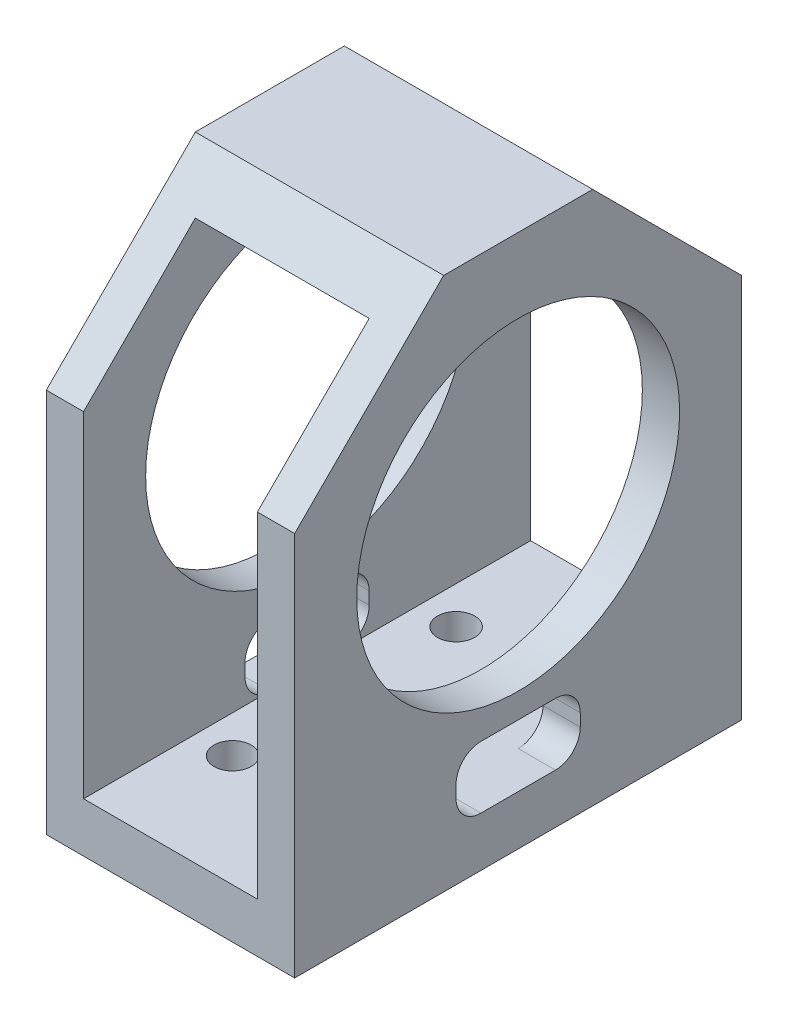
ISO-10303-21;
HEADER;
FILE_DESCRIPTION(('STEP AP214'),'2;1');
FILE_NAME('part.step','',(''),(''),'','','');
FILE_SCHEMA(('AUTOMOTIVE_DESIGN { 1 0 10303 214 1 1 1 1 }'));
ENDSEC;
DATA;
#1=APPLICATION_CONTEXT('core data for automotive mechanical design processes');
#2=APPLICATION_PROTOCOL_DEFINITION('international standard','automotive_design',2000,#1);
#3=PRODUCT_CONTEXT('',#1,'mechanical');
#4=PRODUCT('Part','Part','',(#3));
#5=PRODUCT_RELATED_PRODUCT_CATEGORY('part','',(#4));
#6=PRODUCT_DEFINITION_FORMATION('','',#4);
#7=PRODUCT_DEFINITION_CONTEXT('part definition',#1,'design');
#8=PRODUCT_DEFINITION('design','',#6,#7);
#9=PRODUCT_DEFINITION_SHAPE('','',#8);
#10=(LENGTH_UNIT() NAMED_UNIT(*) SI_UNIT(.MILLI.,.METRE.));
#11=(NAMED_UNIT(*) PLANE_ANGLE_UNIT() SI_UNIT($,.RADIAN.));
#12=(NAMED_UNIT(*) SI_UNIT($,.STERADIAN.) SOLID_ANGLE_UNIT());
#13=UNCERTAINTY_MEASURE_WITH_UNIT(LENGTH_MEASURE(1.E-05),#10,'distance_accuracy_value','');
#14=(GEOMETRIC_REPRESENTATION_CONTEXT(3) GLOBAL_UNCERTAINTY_ASSIGNED_CONTEXT((#13)) GLOBAL_UNIT_ASSIGNED_CONTEXT((#10,
#11,#12)) REPRESENTATION_CONTEXT('',''));
#15=CARTESIAN_POINT('',(0.,0.,0.));
#16=DIRECTION('',(0.,0.,1.));
#17=DIRECTION('',(1.,0.,0.));
#18=AXIS2_PLACEMENT_3D('',#15,#16,#17);
#19=CARTESIAN_POINT('',(0.,4.,0.));
#20=DIRECTION('',(0.,-1.,0.));
#21=DIRECTION('',(0.,0.,-1.));
#22=AXIS2_PLACEMENT_3D('',#19,#20,#21);
#23=PLANE('',#22);
#24=CARTESIAN_POINT('',(-4.,4.,-9.));
#25=DIRECTION('',(0.,1.,0.));
#26=DIRECTION('',(0.,0.,-1.));
#27=AXIS2_PLACEMENT_3D('',#24,#25,#26);
#28=CIRCLE('',#27,1.5);
#29=CARTESIAN_POINT('',(-4.,4.,-10.5));
#30=VERTEX_POINT('',#29);
#31=EDGE_CURVE('E399',#30,#30,#28,.T.);
#32=ORIENTED_EDGE('',*,*,#31,.F.);
#33=EDGE_LOOP('',(#32));
#34=FACE_BOUND('',#33,.T.);
#35=CARTESIAN_POINT('',(4.,4.,-9.));
#36=DIRECTION('',(0.,1.,0.));
#37=DIRECTION('',(0.,0.,1.));
#38=AXIS2_PLACEMENT_3D('',#35,#36,#37);
#39=CIRCLE('',#38,1.5);
#40=CARTESIAN_POINT('',(4.,4.,-7.5));
#41=VERTEX_POINT('',#40);
#42=EDGE_CURVE('E398',#41,#41,#39,.T.);
#43=ORIENTED_EDGE('',*,*,#42,.F.);
#44=EDGE_LOOP('',(#43));
#45=FACE_BOUND('',#44,.T.);
#46=DIRECTION('',(0.,0.,-1.));
#47=VECTOR('',#46,1.);
#48=CARTESIAN_POINT('',(-10.,4.,5.));
#49=LINE('',#48,#47);
#50=CARTESIAN_POINT('',(-10.,4.,3.));
#51=VERTEX_POINT('',#50);
#52=CARTESIAN_POINT('',(-10.,4.,-3.));
#53=VERTEX_POINT('',#52);
#54=EDGE_CURVE('E372',#51,#53,#49,.T.);
#55=ORIENTED_EDGE('',*,*,#54,.F.);
#56=DIRECTION('',(1.,0.,0.));
#57=VECTOR('',#56,1.);
#58=CARTESIAN_POINT('',(-7.,4.,3.));
#59=LINE('',#58,#57);
#60=CARTESIAN_POINT('',(-7.,4.,3.));
#61=VERTEX_POINT('',#60);
#62=EDGE_CURVE('E281',#51,#61,#59,.T.);
#63=ORIENTED_EDGE('',*,*,#62,.T.);
#64=DIRECTION('',(0.,0.,-1.));
#65=VECTOR('',#64,1.);
#66=CARTESIAN_POINT('',(-7.,4.,-18.));
#67=LINE('',#66,#65);
#68=CARTESIAN_POINT('',(-7.,4.,18.));
#69=VERTEX_POINT('',#68);
#70=EDGE_CURVE('E468',#69,#61,#67,.T.);
#71=ORIENTED_EDGE('',*,*,#70,.F.);
#72=DIRECTION('',(1.,0.,0.));
#73=VECTOR('',#72,1.);
#74=CARTESIAN_POINT('',(-10.,4.,18.));
#75=LINE('',#74,#73);
#76=CARTESIAN_POINT('',(7.,4.,18.));
#77=VERTEX_POINT('',#76);
#78=EDGE_CURVE('E256',#69,#77,#75,.T.);
#79=ORIENTED_EDGE('',*,*,#78,.T.);
#80=DIRECTION('',(0.,0.,1.));
#81=VECTOR('',#80,1.);
#82=CARTESIAN_POINT('',(7.,4.,-18.));
#83=LINE('',#82,#81);
#84=CARTESIAN_POINT('',(7.00000000000001,4.,3.));
#85=VERTEX_POINT('',#84);
#86=EDGE_CURVE('E356',#85,#77,#83,.T.);
#87=ORIENTED_EDGE('',*,*,#86,.F.);
#88=DIRECTION('',(1.,0.,0.));
#89=VECTOR('',#88,1.);
#90=CARTESIAN_POINT('',(10.,4.,3.));
#91=LINE('',#90,#89);
#92=CARTESIAN_POINT('',(10.,4.,3.));
#93=VERTEX_POINT('',#92);
#94=EDGE_CURVE('E273',#85,#93,#91,.T.);
#95=ORIENTED_EDGE('',*,*,#94,.T.);
#96=DIRECTION('',(0.,0.,-1.));
#97=VECTOR('',#96,1.);
#98=CARTESIAN_POINT('',(10.,4.,5.));
#99=LINE('',#98,#97);
#100=CARTESIAN_POINT('',(10.,4.,-3.));
#101=VERTEX_POINT('',#100);
#102=EDGE_CURVE('E347',#93,#101,#99,.T.);
#103=ORIENTED_EDGE('',*,*,#102,.T.);
#104=DIRECTION('',(1.,0.,0.));
#105=VECTOR('',#104,1.);
#106=CARTESIAN_POINT('',(7.,4.,-3.));
#107=LINE('',#106,#105);
#108=CARTESIAN_POINT('',(7.00000000000001,4.,-3.));
#109=VERTEX_POINT('',#108);
#110=EDGE_CURVE('E276',#101,#109,#107,.F.);
#111=ORIENTED_EDGE('',*,*,#110,.T.);
#112=CARTESIAN_POINT('',(7.,4.,-18.));
#113=VERTEX_POINT('',#112);
#114=EDGE_CURVE('E458',#113,#109,#83,.T.);
#115=ORIENTED_EDGE('',*,*,#114,.F.);
#116=DIRECTION('',(-1.,0.,0.));
#117=VECTOR('',#116,1.);
#118=CARTESIAN_POINT('',(-10.,4.,-18.));
#119=LINE('',#118,#117);
#120=CARTESIAN_POINT('',(-7.,4.,-18.));
#121=VERTEX_POINT('',#120);
#122=EDGE_CURVE('E474',#113,#121,#119,.T.);
#123=ORIENTED_EDGE('',*,*,#122,.T.);
#124=CARTESIAN_POINT('',(-7.,4.,-3.));
#125=VERTEX_POINT('',#124);
#126=EDGE_CURVE('E463',#125,#121,#67,.T.);
#127=ORIENTED_EDGE('',*,*,#126,.F.);
#128=DIRECTION('',(1.,0.,0.));
#129=VECTOR('',#128,1.);
#130=CARTESIAN_POINT('',(-10.,4.,-3.));
#131=LINE('',#130,#129);
#132=EDGE_CURVE('E279',#125,#53,#131,.F.);
#133=ORIENTED_EDGE('',*,*,#132,.T.);
#134=EDGE_LOOP('',(#55,#63,#71,#79,#87,#95,#103,#111,#115,#123,#127,#133));
#135=FACE_BOUND('',#134,.T.);
#136=CARTESIAN_POINT('',(-4.,4.,9.));
#137=DIRECTION('',(0.,1.,0.));
#138=DIRECTION('',(0.,0.,1.));
#139=AXIS2_PLACEMENT_3D('',#136,#137,#138);
#140=CIRCLE('',#139,1.5);
#141=CARTESIAN_POINT('',(-4.,4.,10.5));
#142=VERTEX_POINT('',#141);
#143=EDGE_CURVE('E388',#142,#142,#140,.T.);
#144=ORIENTED_EDGE('',*,*,#143,.F.);
#145=EDGE_LOOP('',(#144));
#146=FACE_BOUND('',#145,.T.);
#147=CARTESIAN_POINT('',(4.,4.,9.));
#148=DIRECTION('',(0.,1.,0.));
#149=DIRECTION('',(0.,0.,-1.));
#150=AXIS2_PLACEMENT_3D('',#147,#148,#149);
#151=CIRCLE('',#150,1.5);
#152=CARTESIAN_POINT('',(4.,4.,7.5));
#153=VERTEX_POINT('',#152);
#154=EDGE_CURVE('E392',#153,#153,#151,.T.);
#155=ORIENTED_EDGE('',*,*,#154,.F.);
#156=EDGE_LOOP('',(#155));
#157=FACE_BOUND('',#156,.T.);
#158=ADVANCED_FACE('F37',(#34,#45,#135,#146,#157),#23,.F.);
#159=CARTESIAN_POINT('',(10.,4.,18.));
#160=DIRECTION('',(-1.,0.,0.));
#161=DIRECTION('',(0.,0.,1.));
#162=AXIS2_PLACEMENT_3D('',#159,#160,#161);
#163=PLANE('',#162);
#164=ORIENTED_EDGE('',*,*,#102,.F.);
#165=CARTESIAN_POINT('',(10.,6.,3.));
#166=DIRECTION('',(-1.,0.,0.));
#167=DIRECTION('',(0.,0.,1.));
#168=AXIS2_PLACEMENT_3D('',#165,#166,#167);
#169=CIRCLE('',#168,2.);
#170=CARTESIAN_POINT('',(10.,6.,5.));
#171=VERTEX_POINT('',#170);
#172=EDGE_CURVE('E45',#93,#171,#169,.T.);
#173=ORIENTED_EDGE('',*,*,#172,.T.);
#174=DIRECTION('',(0.,-1.,0.));
#175=VECTOR('',#174,1.);
#176=CARTESIAN_POINT('',(10.,4.,5.));
#177=LINE('',#176,#175);
#178=CARTESIAN_POINT('',(10.,7.,5.));
#179=VERTEX_POINT('',#178);
#180=EDGE_CURVE('E345',#179,#171,#177,.T.);
#181=ORIENTED_EDGE('',*,*,#180,.F.);
#182=CARTESIAN_POINT('',(10.,7.,3.));
#183=DIRECTION('',(-1.,0.,0.));
#184=DIRECTION('',(0.,0.,1.));
#185=AXIS2_PLACEMENT_3D('',#182,#183,#184);
#186=CIRCLE('',#185,2.);
#187=CARTESIAN_POINT('',(10.,9.,3.));
#188=VERTEX_POINT('',#187);
#189=EDGE_CURVE('E338',#179,#188,#186,.T.);
#190=ORIENTED_EDGE('',*,*,#189,.T.);
#191=DIRECTION('',(0.,0.,1.));
#192=VECTOR('',#191,1.);
#193=CARTESIAN_POINT('',(10.,9.,5.));
#194=LINE('',#193,#192);
#195=CARTESIAN_POINT('',(10.,9.,-3.));
#196=VERTEX_POINT('',#195);
#197=EDGE_CURVE('E363',#196,#188,#194,.T.);
#198=ORIENTED_EDGE('',*,*,#197,.F.);
#199=CARTESIAN_POINT('',(10.,7.,-3.));
#200=DIRECTION('',(-1.,0.,0.));
#201=DIRECTION('',(0.,0.,1.));
#202=AXIS2_PLACEMENT_3D('',#199,#200,#201);
#203=CIRCLE('',#202,2.);
#204=CARTESIAN_POINT('',(10.,7.,-5.));
#205=VERTEX_POINT('',#204);
#206=EDGE_CURVE('E334',#196,#205,#203,.T.);
#207=ORIENTED_EDGE('',*,*,#206,.T.);
#208=DIRECTION('',(0.,1.,0.));
#209=VECTOR('',#208,1.);
#210=CARTESIAN_POINT('',(10.,4.,-5.));
#211=LINE('',#210,#209);
#212=CARTESIAN_POINT('',(10.,6.,-5.));
#213=VERTEX_POINT('',#212);
#214=EDGE_CURVE('E369',#213,#205,#211,.T.);
#215=ORIENTED_EDGE('',*,*,#214,.F.);
#216=CARTESIAN_POINT('',(10.,6.,-3.));
#217=DIRECTION('',(-1.,0.,0.));
#218=DIRECTION('',(0.,0.,1.));
#219=AXIS2_PLACEMENT_3D('',#216,#217,#218);
#220=CIRCLE('',#219,2.);
#221=EDGE_CURVE('E330',#213,#101,#220,.T.);
#222=ORIENTED_EDGE('',*,*,#221,.T.);
#223=EDGE_LOOP('',(#164,#173,#181,#190,#198,#207,#215,#222));
#224=FACE_BOUND('',#223,.T.);
#225=CARTESIAN_POINT('',(10.,24.,0.));
#226=DIRECTION('',(1.,0.,0.));
#227=DIRECTION('',(0.,0.,-1.));
#228=AXIS2_PLACEMENT_3D('',#225,#226,#227);
#229=CIRCLE('',#228,13.);
#230=CARTESIAN_POINT('',(10.,24.,-13.));
#231=VERTEX_POINT('',#230);
#232=EDGE_CURVE('E442',#231,#231,#229,.T.);
#233=ORIENTED_EDGE('',*,*,#232,.F.);
#234=EDGE_LOOP('',(#233));
#235=FACE_BOUND('',#234,.T.);
#236=DIRECTION('',(0.,0.,-1.));
#237=VECTOR('',#236,1.);
#238=CARTESIAN_POINT('',(10.,43.,-18.));
#239=LINE('',#238,#237);
#240=CARTESIAN_POINT('',(10.,43.,6.));
#241=VERTEX_POINT('',#240);
#242=CARTESIAN_POINT('',(10.,43.,-6.));
#243=VERTEX_POINT('',#242);
#244=EDGE_CURVE('E451',#241,#243,#239,.T.);
#245=ORIENTED_EDGE('',*,*,#244,.F.);
#246=DIRECTION('',(0.,0.707106781186548,-0.707106781186548));
#247=VECTOR('',#246,1.);
#248=CARTESIAN_POINT('',(10.,43.,6.));
#249=LINE('',#248,#247);
#250=CARTESIAN_POINT('',(10.,31.,18.));
#251=VERTEX_POINT('',#250);
#252=EDGE_CURVE('E235',#251,#241,#249,.T.);
#253=ORIENTED_EDGE('',*,*,#252,.F.);
#254=DIRECTION('',(0.,-1.,0.));
#255=VECTOR('',#254,1.);
#256=CARTESIAN_POINT('',(10.,4.,18.));
#257=LINE('',#256,#255);
#258=CARTESIAN_POINT('',(10.,0.,18.));
#259=VERTEX_POINT('',#258);
#260=EDGE_CURVE('E252',#251,#259,#257,.T.);
#261=ORIENTED_EDGE('',*,*,#260,.T.);
#262=DIRECTION('',(0.,0.,-1.));
#263=VECTOR('',#262,1.);
#264=CARTESIAN_POINT('',(10.,0.,18.));
#265=LINE('',#264,#263);
#266=CARTESIAN_POINT('',(10.,0.,-18.));
#267=VERTEX_POINT('',#266);
#268=EDGE_CURVE('E473',#259,#267,#265,.T.);
#269=ORIENTED_EDGE('',*,*,#268,.T.);
#270=DIRECTION('',(0.,-1.,0.));
#271=VECTOR('',#270,1.);
#272=CARTESIAN_POINT('',(10.,4.,-18.));
#273=LINE('',#272,#271);
#274=CARTESIAN_POINT('',(10.,31.,-18.));
#275=VERTEX_POINT('',#274);
#276=EDGE_CURVE('E254',#275,#267,#273,.T.);
#277=ORIENTED_EDGE('',*,*,#276,.F.);
#278=DIRECTION('',(0.,-0.707106781186547,-0.707106781186548));
#279=VECTOR('',#278,1.);
#280=CARTESIAN_POINT('',(10.,43.,-6.));
#281=LINE('',#280,#279);
#282=EDGE_CURVE('E410',#243,#275,#281,.T.);
#283=ORIENTED_EDGE('',*,*,#282,.F.);
#284=EDGE_LOOP('',(#245,#253,#261,#269,#277,#283));
#285=FACE_BOUND('',#284,.T.);
#286=ADVANCED_FACE('F343',(#224,#235,#285),#163,.F.);
#287=CARTESIAN_POINT('',(-10.,4.,-18.));
#288=DIRECTION('',(0.,0.,1.));
#289=DIRECTION('',(1.,0.,0.));
#290=AXIS2_PLACEMENT_3D('',#287,#288,#289);
#291=PLANE('',#290);
#292=DIRECTION('',(0.,-1.,0.));
#293=VECTOR('',#292,1.);
#294=CARTESIAN_POINT('',(-10.,4.,-18.));
#295=LINE('',#294,#293);
#296=CARTESIAN_POINT('',(-10.,31.,-18.));
#297=VERTEX_POINT('',#296);
#298=CARTESIAN_POINT('',(-10.,0.,-18.));
#299=VERTEX_POINT('',#298);
#300=EDGE_CURVE('E251',#297,#299,#295,.T.);
#301=ORIENTED_EDGE('',*,*,#300,.F.);
#302=DIRECTION('',(1.,0.,0.));
#303=VECTOR('',#302,1.);
#304=CARTESIAN_POINT('',(-10.,31.,-18.));
#305=LINE('',#304,#303);
#306=CARTESIAN_POINT('',(-7.,31.,-18.));
#307=VERTEX_POINT('',#306);
#308=EDGE_CURVE('E423',#297,#307,#305,.T.);
#309=ORIENTED_EDGE('',*,*,#308,.T.);
#310=DIRECTION('',(0.,-1.,0.));
#311=VECTOR('',#310,1.);
#312=CARTESIAN_POINT('',(-7.,40.,-18.));
#313=LINE('',#312,#311);
#314=EDGE_CURVE('E467',#307,#121,#313,.T.);
#315=ORIENTED_EDGE('',*,*,#314,.T.);
#316=ORIENTED_EDGE('',*,*,#122,.F.);
#317=DIRECTION('',(0.,-1.,0.));
#318=VECTOR('',#317,1.);
#319=CARTESIAN_POINT('',(7.,40.,-18.));
#320=LINE('',#319,#318);
#321=CARTESIAN_POINT('',(7.,31.,-18.));
#322=VERTEX_POINT('',#321);
#323=EDGE_CURVE('E461',#322,#113,#320,.T.);
#324=ORIENTED_EDGE('',*,*,#323,.F.);
#325=EDGE_CURVE('E420',#322,#275,#305,.T.);
#326=ORIENTED_EDGE('',*,*,#325,.T.);
#327=ORIENTED_EDGE('',*,*,#276,.T.);
#328=DIRECTION('',(-1.,0.,0.));
#329=VECTOR('',#328,1.);
#330=CARTESIAN_POINT('',(-10.,0.,-18.));
#331=LINE('',#330,#329);
#332=EDGE_CURVE('E482',#267,#299,#331,.T.);
#333=ORIENTED_EDGE('',*,*,#332,.T.);
#334=EDGE_LOOP('',(#301,#309,#315,#316,#324,#326,#327,#333));
#335=FACE_BOUND('',#334,.T.);
#336=ADVANCED_FACE('F501',(#335),#291,.F.);
#337=CARTESIAN_POINT('',(-10.,4.,18.));
#338=DIRECTION('',(1.,0.,0.));
#339=DIRECTION('',(0.,0.,-1.));
#340=AXIS2_PLACEMENT_3D('',#337,#338,#339);
#341=PLANE('',#340);
#342=DIRECTION('',(0.,1.,0.));
#343=VECTOR('',#342,1.);
#344=CARTESIAN_POINT('',(-10.,4.,-5.));
#345=LINE('',#344,#343);
#346=CARTESIAN_POINT('',(-10.,6.,-5.));
#347=VERTEX_POINT('',#346);
#348=CARTESIAN_POINT('',(-10.,7.,-5.));
#349=VERTEX_POINT('',#348);
#350=EDGE_CURVE('E531',#347,#349,#345,.T.);
#351=ORIENTED_EDGE('',*,*,#350,.T.);
#352=CARTESIAN_POINT('',(-10.,7.,-3.));
#353=DIRECTION('',(1.,0.,0.));
#354=DIRECTION('',(0.,0.,-1.));
#355=AXIS2_PLACEMENT_3D('',#352,#353,#354);
#356=CIRCLE('',#355,2.);
#357=CARTESIAN_POINT('',(-10.,9.,-3.));
#358=VERTEX_POINT('',#357);
#359=EDGE_CURVE('E323',#349,#358,#356,.T.);
#360=ORIENTED_EDGE('',*,*,#359,.T.);
#361=DIRECTION('',(0.,0.,1.));
#362=VECTOR('',#361,1.);
#363=CARTESIAN_POINT('',(-10.,9.,5.));
#364=LINE('',#363,#362);
#365=CARTESIAN_POINT('',(-10.,9.,3.));
#366=VERTEX_POINT('',#365);
#367=EDGE_CURVE('E382',#358,#366,#364,.T.);
#368=ORIENTED_EDGE('',*,*,#367,.T.);
#369=CARTESIAN_POINT('',(-10.,7.,3.));
#370=DIRECTION('',(1.,0.,0.));
#371=DIRECTION('',(0.,0.,-1.));
#372=AXIS2_PLACEMENT_3D('',#369,#370,#371);
#373=CIRCLE('',#372,2.);
#374=CARTESIAN_POINT('',(-10.,7.,5.));
#375=VERTEX_POINT('',#374);
#376=EDGE_CURVE('E319',#366,#375,#373,.T.);
#377=ORIENTED_EDGE('',*,*,#376,.T.);
#378=DIRECTION('',(0.,-1.,0.));
#379=VECTOR('',#378,1.);
#380=CARTESIAN_POINT('',(-10.,4.,5.));
#381=LINE('',#380,#379);
#382=CARTESIAN_POINT('',(-10.,6.,5.));
#383=VERTEX_POINT('',#382);
#384=EDGE_CURVE('E368',#375,#383,#381,.T.);
#385=ORIENTED_EDGE('',*,*,#384,.T.);
#386=CARTESIAN_POINT('',(-10.,6.,3.));
#387=DIRECTION('',(1.,0.,0.));
#388=DIRECTION('',(0.,0.,-1.));
#389=AXIS2_PLACEMENT_3D('',#386,#387,#388);
#390=CIRCLE('',#389,2.);
#391=EDGE_CURVE('E315',#383,#51,#390,.T.);
#392=ORIENTED_EDGE('',*,*,#391,.T.);
#393=ORIENTED_EDGE('',*,*,#54,.T.);
#394=CARTESIAN_POINT('',(-10.,6.,-3.));
#395=DIRECTION('',(1.,0.,0.));
#396=DIRECTION('',(0.,0.,-1.));
#397=AXIS2_PLACEMENT_3D('',#394,#395,#396);
#398=CIRCLE('',#397,2.);
#399=EDGE_CURVE('E328',#53,#347,#398,.T.);
#400=ORIENTED_EDGE('',*,*,#399,.T.);
#401=EDGE_LOOP('',(#351,#360,#368,#377,#385,#392,#393,#400));
#402=FACE_BOUND('',#401,.T.);
#403=CARTESIAN_POINT('',(-10.,24.,0.));
#404=DIRECTION('',(1.,0.,0.));
#405=DIRECTION('',(0.,0.,-1.));
#406=AXIS2_PLACEMENT_3D('',#403,#404,#405);
#407=CIRCLE('',#406,13.);
#408=CARTESIAN_POINT('',(-10.,24.,-13.));
#409=VERTEX_POINT('',#408);
#410=EDGE_CURVE('E266',#409,#409,#407,.T.);
#411=ORIENTED_EDGE('',*,*,#410,.T.);
#412=EDGE_LOOP('',(#411));
#413=FACE_BOUND('',#412,.T.);
#414=DIRECTION('',(0.,-1.,0.));
#415=VECTOR('',#414,1.);
#416=CARTESIAN_POINT('',(-10.,4.,18.));
#417=LINE('',#416,#415);
#418=CARTESIAN_POINT('',(-10.,31.,18.));
#419=VERTEX_POINT('',#418);
#420=CARTESIAN_POINT('',(-10.,0.,18.));
#421=VERTEX_POINT('',#420);
#422=EDGE_CURVE('E242',#419,#421,#417,.T.);
#423=ORIENTED_EDGE('',*,*,#422,.F.);
#424=DIRECTION('',(0.,0.707106781186548,-0.707106781186548));
#425=VECTOR('',#424,1.);
#426=CARTESIAN_POINT('',(-10.,43.,6.));
#427=LINE('',#426,#425);
#428=CARTESIAN_POINT('',(-10.,43.,6.));
#429=VERTEX_POINT('',#428);
#430=EDGE_CURVE('E223',#419,#429,#427,.T.);
#431=ORIENTED_EDGE('',*,*,#430,.T.);
#432=DIRECTION('',(0.,0.,1.));
#433=VECTOR('',#432,1.);
#434=CARTESIAN_POINT('',(-10.,43.,-18.));
#435=LINE('',#434,#433);
#436=CARTESIAN_POINT('',(-10.,43.,-6.));
#437=VERTEX_POINT('',#436);
#438=EDGE_CURVE('E449',#437,#429,#435,.T.);
#439=ORIENTED_EDGE('',*,*,#438,.F.);
#440=DIRECTION('',(0.,-0.707106781186547,-0.707106781186548));
#441=VECTOR('',#440,1.);
#442=CARTESIAN_POINT('',(-10.,43.,-6.));
#443=LINE('',#442,#441);
#444=EDGE_CURVE('E417',#437,#297,#443,.T.);
#445=ORIENTED_EDGE('',*,*,#444,.T.);
#446=ORIENTED_EDGE('',*,*,#300,.T.);
#447=DIRECTION('',(0.,0.,1.));
#448=VECTOR('',#447,1.);
#449=CARTESIAN_POINT('',(-10.,0.,18.));
#450=LINE('',#449,#448);
#451=EDGE_CURVE('E249',#299,#421,#450,.T.);
#452=ORIENTED_EDGE('',*,*,#451,.T.);
#453=EDGE_LOOP('',(#423,#431,#439,#445,#446,#452));
#454=FACE_BOUND('',#453,.T.);
#455=ADVANCED_FACE('F247',(#402,#413,#454),#341,.F.);
#456=CARTESIAN_POINT('',(-10.,4.,18.));
#457=DIRECTION('',(0.,0.,-1.));
#458=DIRECTION('',(-1.,0.,0.));
#459=AXIS2_PLACEMENT_3D('',#456,#457,#458);
#460=PLANE('',#459);
#461=ORIENTED_EDGE('',*,*,#260,.F.);
#462=DIRECTION('',(1.,0.,0.));
#463=VECTOR('',#462,1.);
#464=CARTESIAN_POINT('',(-10.,31.,18.));
#465=LINE('',#464,#463);
#466=CARTESIAN_POINT('',(7.00000000000001,31.,18.));
#467=VERTEX_POINT('',#466);
#468=EDGE_CURVE('E234',#467,#251,#465,.T.);
#469=ORIENTED_EDGE('',*,*,#468,.F.);
#470=DIRECTION('',(0.,-1.,0.));
#471=VECTOR('',#470,1.);
#472=CARTESIAN_POINT('',(7.00000000000001,40.,18.));
#473=LINE('',#472,#471);
#474=EDGE_CURVE('E457',#467,#77,#473,.T.);
#475=ORIENTED_EDGE('',*,*,#474,.T.);
#476=ORIENTED_EDGE('',*,*,#78,.F.);
#477=DIRECTION('',(0.,-1.,0.));
#478=VECTOR('',#477,1.);
#479=CARTESIAN_POINT('',(-7.,40.,18.));
#480=LINE('',#479,#478);
#481=CARTESIAN_POINT('',(-7.,31.,18.));
#482=VERTEX_POINT('',#481);
#483=EDGE_CURVE('E245',#482,#69,#480,.T.);
#484=ORIENTED_EDGE('',*,*,#483,.F.);
#485=EDGE_CURVE('E226',#419,#482,#465,.T.);
#486=ORIENTED_EDGE('',*,*,#485,.F.);
#487=ORIENTED_EDGE('',*,*,#422,.T.);
#488=DIRECTION('',(1.,0.,0.));
#489=VECTOR('',#488,1.);
#490=CARTESIAN_POINT('',(-10.,0.,18.));
#491=LINE('',#490,#489);
#492=EDGE_CURVE('E477',#421,#259,#491,.T.);
#493=ORIENTED_EDGE('',*,*,#492,.T.);
#494=EDGE_LOOP('',(#461,#469,#475,#476,#484,#486,#487,#493));
#495=FACE_BOUND('',#494,.T.);
#496=ADVANCED_FACE('F240',(#495),#460,.F.);
#497=CARTESIAN_POINT('',(0.,0.,0.));
#498=DIRECTION('',(0.,-1.,0.));
#499=DIRECTION('',(0.,0.,-1.));
#500=AXIS2_PLACEMENT_3D('',#497,#498,#499);
#501=PLANE('',#500);
#502=CARTESIAN_POINT('',(-4.,0.,-9.));
#503=DIRECTION('',(0.,1.,0.));
#504=DIRECTION('',(0.,0.,-1.));
#505=AXIS2_PLACEMENT_3D('',#502,#503,#504);
#506=CIRCLE('',#505,1.5);
#507=CARTESIAN_POINT('',(-4.,0.,-10.5));
#508=VERTEX_POINT('',#507);
#509=EDGE_CURVE('E395',#508,#508,#506,.T.);
#510=ORIENTED_EDGE('',*,*,#509,.T.);
#511=EDGE_LOOP('',(#510));
#512=FACE_BOUND('',#511,.T.);
#513=CARTESIAN_POINT('',(4.,0.,9.));
#514=DIRECTION('',(0.,1.,0.));
#515=DIRECTION('',(0.,0.,-1.));
#516=AXIS2_PLACEMENT_3D('',#513,#514,#515);
#517=CIRCLE('',#516,1.5);
#518=CARTESIAN_POINT('',(4.,0.,7.5));
#519=VERTEX_POINT('',#518);
#520=EDGE_CURVE('E402',#519,#519,#517,.T.);
#521=ORIENTED_EDGE('',*,*,#520,.T.);
#522=EDGE_LOOP('',(#521));
#523=FACE_BOUND('',#522,.T.);
#524=CARTESIAN_POINT('',(-4.,0.,9.));
#525=DIRECTION('',(0.,1.,0.));
#526=DIRECTION('',(0.,0.,1.));
#527=AXIS2_PLACEMENT_3D('',#524,#525,#526);
#528=CIRCLE('',#527,1.5);
#529=CARTESIAN_POINT('',(-4.,0.,10.5));
#530=VERTEX_POINT('',#529);
#531=EDGE_CURVE('E389',#530,#530,#528,.T.);
#532=ORIENTED_EDGE('',*,*,#531,.T.);
#533=EDGE_LOOP('',(#532));
#534=FACE_BOUND('',#533,.T.);
#535=CARTESIAN_POINT('',(4.,0.,-9.));
#536=DIRECTION('',(0.,1.,0.));
#537=DIRECTION('',(0.,0.,1.));
#538=AXIS2_PLACEMENT_3D('',#535,#536,#537);
#539=CIRCLE('',#538,1.5);
#540=CARTESIAN_POINT('',(4.,0.,-7.5));
#541=VERTEX_POINT('',#540);
#542=EDGE_CURVE('E407',#541,#541,#539,.T.);
#543=ORIENTED_EDGE('',*,*,#542,.T.);
#544=EDGE_LOOP('',(#543));
#545=FACE_BOUND('',#544,.T.);
#546=ORIENTED_EDGE('',*,*,#268,.F.);
#547=ORIENTED_EDGE('',*,*,#492,.F.);
#548=ORIENTED_EDGE('',*,*,#451,.F.);
#549=ORIENTED_EDGE('',*,*,#332,.F.);
#550=EDGE_LOOP('',(#546,#547,#548,#549));
#551=FACE_BOUND('',#550,.T.);
#552=ADVANCED_FACE('F489',(#512,#523,#534,#545,#551),#501,.T.);
#553=CARTESIAN_POINT('',(-7.,40.,-18.));
#554=DIRECTION('',(-1.,0.,0.));
#555=DIRECTION('',(0.,0.,1.));
#556=AXIS2_PLACEMENT_3D('',#553,#554,#555);
#557=PLANE('',#556);
#558=CARTESIAN_POINT('',(-7.,24.,0.));
#559=DIRECTION('',(-1.,0.,0.));
#560=DIRECTION('',(0.,0.,1.));
#561=AXIS2_PLACEMENT_3D('',#558,#559,#560);
#562=CIRCLE('',#561,13.);
#563=CARTESIAN_POINT('',(-7.,24.,13.));
#564=VERTEX_POINT('',#563);
#565=EDGE_CURVE('E265',#564,#564,#562,.T.);
#566=ORIENTED_EDGE('',*,*,#565,.T.);
#567=EDGE_LOOP('',(#566));
#568=FACE_BOUND('',#567,.T.);
#569=ORIENTED_EDGE('',*,*,#70,.T.);
#570=CARTESIAN_POINT('',(-7.,6.,3.));
#571=DIRECTION('',(-1.,0.,0.));
#572=DIRECTION('',(0.,0.,1.));
#573=AXIS2_PLACEMENT_3D('',#570,#571,#572);
#574=CIRCLE('',#573,2.);
#575=CARTESIAN_POINT('',(-7.,6.,5.));
#576=VERTEX_POINT('',#575);
#577=EDGE_CURVE('E313',#61,#576,#574,.T.);
#578=ORIENTED_EDGE('',*,*,#577,.T.);
#579=DIRECTION('',(0.,1.,0.));
#580=VECTOR('',#579,1.);
#581=CARTESIAN_POINT('',(-7.,40.,5.));
#582=LINE('',#581,#580);
#583=CARTESIAN_POINT('',(-7.,7.,5.));
#584=VERTEX_POINT('',#583);
#585=EDGE_CURVE('E385',#576,#584,#582,.T.);
#586=ORIENTED_EDGE('',*,*,#585,.T.);
#587=CARTESIAN_POINT('',(-7.,7.,3.));
#588=DIRECTION('',(-1.,0.,0.));
#589=DIRECTION('',(0.,0.,1.));
#590=AXIS2_PLACEMENT_3D('',#587,#588,#589);
#591=CIRCLE('',#590,2.);
#592=CARTESIAN_POINT('',(-7.,9.,3.));
#593=VERTEX_POINT('',#592);
#594=EDGE_CURVE('E317',#584,#593,#591,.T.);
#595=ORIENTED_EDGE('',*,*,#594,.T.);
#596=DIRECTION('',(0.,0.,-1.));
#597=VECTOR('',#596,1.);
#598=CARTESIAN_POINT('',(-7.,9.,-18.));
#599=LINE('',#598,#597);
#600=CARTESIAN_POINT('',(-7.,9.,-3.));
#601=VERTEX_POINT('',#600);
#602=EDGE_CURVE('E381',#593,#601,#599,.T.);
#603=ORIENTED_EDGE('',*,*,#602,.T.);
#604=CARTESIAN_POINT('',(-7.,7.,-3.));
#605=DIRECTION('',(-1.,0.,0.));
#606=DIRECTION('',(0.,0.,1.));
#607=AXIS2_PLACEMENT_3D('',#604,#605,#606);
#608=CIRCLE('',#607,2.);
#609=CARTESIAN_POINT('',(-7.,7.,-5.));
#610=VERTEX_POINT('',#609);
#611=EDGE_CURVE('E321',#601,#610,#608,.T.);
#612=ORIENTED_EDGE('',*,*,#611,.T.);
#613=DIRECTION('',(0.,-1.,0.));
#614=VECTOR('',#613,1.);
#615=CARTESIAN_POINT('',(-7.,40.,-5.));
#616=LINE('',#615,#614);
#617=CARTESIAN_POINT('',(-7.,6.,-5.));
#618=VERTEX_POINT('',#617);
#619=EDGE_CURVE('E378',#610,#618,#616,.T.);
#620=ORIENTED_EDGE('',*,*,#619,.T.);
#621=CARTESIAN_POINT('',(-7.,6.,-3.));
#622=DIRECTION('',(-1.,0.,0.));
#623=DIRECTION('',(0.,0.,1.));
#624=AXIS2_PLACEMENT_3D('',#621,#622,#623);
#625=CIRCLE('',#624,2.);
#626=EDGE_CURVE('E325',#618,#125,#625,.T.);
#627=ORIENTED_EDGE('',*,*,#626,.T.);
#628=ORIENTED_EDGE('',*,*,#126,.T.);
#629=ORIENTED_EDGE('',*,*,#314,.F.);
#630=DIRECTION('',(0.,0.707106781186547,0.707106781186548));
#631=VECTOR('',#630,1.);
#632=CARTESIAN_POINT('',(-7.,35.5,-13.5));
#633=LINE('',#632,#631);
#634=CARTESIAN_POINT('',(-7.,40.,-9.));
#635=VERTEX_POINT('',#634);
#636=EDGE_CURVE('E431',#307,#635,#633,.T.);
#637=ORIENTED_EDGE('',*,*,#636,.T.);
#638=DIRECTION('',(0.,0.,-1.));
#639=VECTOR('',#638,1.);
#640=CARTESIAN_POINT('',(-7.,40.,-18.));
#641=LINE('',#640,#639);
#642=CARTESIAN_POINT('',(-7.,40.,9.));
#643=VERTEX_POINT('',#642);
#644=EDGE_CURVE('E464',#643,#635,#641,.T.);
#645=ORIENTED_EDGE('',*,*,#644,.F.);
#646=DIRECTION('',(0.,-0.707106781186548,0.707106781186548));
#647=VECTOR('',#646,1.);
#648=CARTESIAN_POINT('',(-7.,53.5,-4.5));
#649=LINE('',#648,#647);
#650=EDGE_CURVE('E440',#643,#482,#649,.T.);
#651=ORIENTED_EDGE('',*,*,#650,.T.);
#652=ORIENTED_EDGE('',*,*,#483,.T.);
#653=EDGE_LOOP('',(#569,#578,#586,#595,#603,#612,#620,#627,#628,#629,#637,#645,#651,#652));
#654=FACE_BOUND('',#653,.T.);
#655=ADVANCED_FACE('F513',(#568,#654),#557,.F.);
#656=CARTESIAN_POINT('',(7.,40.,-18.));
#657=DIRECTION('',(1.,0.,0.));
#658=DIRECTION('',(0.,0.,-1.));
#659=AXIS2_PLACEMENT_3D('',#656,#657,#658);
#660=PLANE('',#659);
#661=CARTESIAN_POINT('',(7.00000000000001,24.,0.));
#662=DIRECTION('',(1.,0.,0.));
#663=DIRECTION('',(0.,0.,-1.));
#664=AXIS2_PLACEMENT_3D('',#661,#662,#663);
#665=CIRCLE('',#664,13.);
#666=CARTESIAN_POINT('',(7.00000000000001,24.,-13.));
#667=VERTEX_POINT('',#666);
#668=EDGE_CURVE('E262',#667,#667,#665,.T.);
#669=ORIENTED_EDGE('',*,*,#668,.T.);
#670=EDGE_LOOP('',(#669));
#671=FACE_BOUND('',#670,.T.);
#672=DIRECTION('',(0.,1.,0.));
#673=VECTOR('',#672,1.);
#674=CARTESIAN_POINT('',(7.00000000000001,40.,-5.));
#675=LINE('',#674,#673);
#676=CARTESIAN_POINT('',(7.00000000000001,6.,-5.));
#677=VERTEX_POINT('',#676);
#678=CARTESIAN_POINT('',(7.00000000000001,7.,-5.));
#679=VERTEX_POINT('',#678);
#680=EDGE_CURVE('E261',#677,#679,#675,.T.);
#681=ORIENTED_EDGE('',*,*,#680,.T.);
#682=CARTESIAN_POINT('',(7.00000000000001,7.,-3.));
#683=DIRECTION('',(1.,0.,0.));
#684=DIRECTION('',(0.,0.,-1.));
#685=AXIS2_PLACEMENT_3D('',#682,#683,#684);
#686=CIRCLE('',#685,2.);
#687=CARTESIAN_POINT('',(7.00000000000001,9.,-3.));
#688=VERTEX_POINT('',#687);
#689=EDGE_CURVE('E336',#679,#688,#686,.T.);
#690=ORIENTED_EDGE('',*,*,#689,.T.);
#691=DIRECTION('',(0.,0.,1.));
#692=VECTOR('',#691,1.);
#693=CARTESIAN_POINT('',(7.,9.,-18.));
#694=LINE('',#693,#692);
#695=CARTESIAN_POINT('',(7.00000000000001,9.,3.));
#696=VERTEX_POINT('',#695);
#697=EDGE_CURVE('E269',#688,#696,#694,.T.);
#698=ORIENTED_EDGE('',*,*,#697,.T.);
#699=CARTESIAN_POINT('',(7.00000000000001,7.,3.));
#700=DIRECTION('',(1.,0.,0.));
#701=DIRECTION('',(0.,0.,-1.));
#702=AXIS2_PLACEMENT_3D('',#699,#700,#701);
#703=CIRCLE('',#702,2.);
#704=CARTESIAN_POINT('',(7.00000000000001,7.,5.));
#705=VERTEX_POINT('',#704);
#706=EDGE_CURVE('E59',#696,#705,#703,.T.);
#707=ORIENTED_EDGE('',*,*,#706,.T.);
#708=DIRECTION('',(0.,-1.,0.));
#709=VECTOR('',#708,1.);
#710=CARTESIAN_POINT('',(7.00000000000001,40.,5.));
#711=LINE('',#710,#709);
#712=CARTESIAN_POINT('',(7.00000000000001,6.,5.));
#713=VERTEX_POINT('',#712);
#714=EDGE_CURVE('E271',#705,#713,#711,.T.);
#715=ORIENTED_EDGE('',*,*,#714,.T.);
#716=CARTESIAN_POINT('',(7.00000000000001,6.,3.));
#717=DIRECTION('',(1.,0.,0.));
#718=DIRECTION('',(0.,0.,-1.));
#719=AXIS2_PLACEMENT_3D('',#716,#717,#718);
#720=CIRCLE('',#719,2.);
#721=EDGE_CURVE('E11',#713,#85,#720,.T.);
#722=ORIENTED_EDGE('',*,*,#721,.T.);
#723=ORIENTED_EDGE('',*,*,#86,.T.);
#724=ORIENTED_EDGE('',*,*,#474,.F.);
#725=DIRECTION('',(0.,0.707106781186548,-0.707106781186548));
#726=VECTOR('',#725,1.);
#727=CARTESIAN_POINT('',(7.00000000000001,53.5,-4.5));
#728=LINE('',#727,#726);
#729=CARTESIAN_POINT('',(7.,40.,9.));
#730=VERTEX_POINT('',#729);
#731=EDGE_CURVE('E437',#467,#730,#728,.T.);
#732=ORIENTED_EDGE('',*,*,#731,.T.);
#733=DIRECTION('',(0.,0.,1.));
#734=VECTOR('',#733,1.);
#735=CARTESIAN_POINT('',(7.,40.,-18.));
#736=LINE('',#735,#734);
#737=CARTESIAN_POINT('',(7.,40.,-9.));
#738=VERTEX_POINT('',#737);
#739=EDGE_CURVE('E454',#738,#730,#736,.T.);
#740=ORIENTED_EDGE('',*,*,#739,.F.);
#741=DIRECTION('',(0.,-0.707106781186547,-0.707106781186548));
#742=VECTOR('',#741,1.);
#743=CARTESIAN_POINT('',(7.,35.5,-13.5));
#744=LINE('',#743,#742);
#745=EDGE_CURVE('E428',#738,#322,#744,.T.);
#746=ORIENTED_EDGE('',*,*,#745,.T.);
#747=ORIENTED_EDGE('',*,*,#323,.T.);
#748=ORIENTED_EDGE('',*,*,#114,.T.);
#749=CARTESIAN_POINT('',(7.00000000000001,6.,-3.));
#750=DIRECTION('',(1.,0.,0.));
#751=DIRECTION('',(0.,0.,-1.));
#752=AXIS2_PLACEMENT_3D('',#749,#750,#751);
#753=CIRCLE('',#752,2.);
#754=EDGE_CURVE('E332',#109,#677,#753,.T.);
#755=ORIENTED_EDGE('',*,*,#754,.T.);
#756=EDGE_LOOP('',(#681,#690,#698,#707,#715,#722,#723,#724,#732,#740,#746,#747,#748,#755));
#757=FACE_BOUND('',#756,.T.);
#758=ADVANCED_FACE('F354',(#671,#757),#660,.F.);
#759=CARTESIAN_POINT('',(0.,40.,0.));
#760=DIRECTION('',(0.,1.,0.));
#761=DIRECTION('',(0.,0.,1.));
#762=AXIS2_PLACEMENT_3D('',#759,#760,#761);
#763=PLANE('',#762);
#764=ORIENTED_EDGE('',*,*,#739,.T.);
#765=DIRECTION('',(-1.,0.,0.));
#766=VECTOR('',#765,1.);
#767=CARTESIAN_POINT('',(0.,40.,9.));
#768=LINE('',#767,#766);
#769=EDGE_CURVE('E434',#730,#643,#768,.T.);
#770=ORIENTED_EDGE('',*,*,#769,.T.);
#771=ORIENTED_EDGE('',*,*,#644,.T.);
#772=DIRECTION('',(1.,0.,0.));
#773=VECTOR('',#772,1.);
#774=CARTESIAN_POINT('',(0.,40.,-9.));
#775=LINE('',#774,#773);
#776=EDGE_CURVE('E415',#635,#738,#775,.T.);
#777=ORIENTED_EDGE('',*,*,#776,.T.);
#778=EDGE_LOOP('',(#764,#770,#771,#777));
#779=FACE_BOUND('',#778,.T.);
#780=ADVANCED_FACE('F510',(#779),#763,.F.);
#781=CARTESIAN_POINT('',(0.,43.,0.));
#782=DIRECTION('',(0.,1.,0.));
#783=DIRECTION('',(0.,0.,1.));
#784=AXIS2_PLACEMENT_3D('',#781,#782,#783);
#785=PLANE('',#784);
#786=DIRECTION('',(1.,0.,0.));
#787=VECTOR('',#786,1.);
#788=CARTESIAN_POINT('',(-10.,43.,6.));
#789=LINE('',#788,#787);
#790=EDGE_CURVE('E229',#429,#241,#789,.T.);
#791=ORIENTED_EDGE('',*,*,#790,.T.);
#792=ORIENTED_EDGE('',*,*,#244,.T.);
#793=DIRECTION('',(1.,0.,0.));
#794=VECTOR('',#793,1.);
#795=CARTESIAN_POINT('',(-10.,43.,-6.));
#796=LINE('',#795,#794);
#797=EDGE_CURVE('E414',#437,#243,#796,.T.);
#798=ORIENTED_EDGE('',*,*,#797,.F.);
#799=ORIENTED_EDGE('',*,*,#438,.T.);
#800=EDGE_LOOP('',(#791,#792,#798,#799));
#801=FACE_BOUND('',#800,.T.);
#802=ADVANCED_FACE('F496',(#801),#785,.T.);
#803=CARTESIAN_POINT('',(-10.,24.,0.));
#804=DIRECTION('',(1.,0.,0.));
#805=DIRECTION('',(0.,0.,-1.));
#806=AXIS2_PLACEMENT_3D('',#803,#804,#805);
#807=CYLINDRICAL_SURFACE('',#806,13.);
#808=ORIENTED_EDGE('',*,*,#232,.T.);
#809=EDGE_LOOP('',(#808));
#810=FACE_BOUND('',#809,.T.);
#811=ORIENTED_EDGE('',*,*,#668,.F.);
#812=EDGE_LOOP('',(#811));
#813=FACE_BOUND('',#812,.T.);
#814=ADVANCED_FACE('F654',(#810,#813),#807,.F.);
#815=ORIENTED_EDGE('',*,*,#410,.F.);
#816=EDGE_LOOP('',(#815));
#817=FACE_BOUND('',#816,.T.);
#818=ORIENTED_EDGE('',*,*,#565,.F.);
#819=EDGE_LOOP('',(#818));
#820=FACE_BOUND('',#819,.T.);
#821=ADVANCED_FACE('F662',(#817,#820),#807,.F.);
#822=CARTESIAN_POINT('',(-10.,43.,-6.));
#823=DIRECTION('',(0.,-0.707106781186548,0.707106781186547));
#824=DIRECTION('',(0.,-0.707106781186547,-0.707106781186548));
#825=AXIS2_PLACEMENT_3D('',#822,#823,#824);
#826=PLANE('',#825);
#827=ORIENTED_EDGE('',*,*,#308,.F.);
#828=ORIENTED_EDGE('',*,*,#444,.F.);
#829=ORIENTED_EDGE('',*,*,#797,.T.);
#830=ORIENTED_EDGE('',*,*,#282,.T.);
#831=ORIENTED_EDGE('',*,*,#325,.F.);
#832=ORIENTED_EDGE('',*,*,#745,.F.);
#833=ORIENTED_EDGE('',*,*,#776,.F.);
#834=ORIENTED_EDGE('',*,*,#636,.F.);
#835=EDGE_LOOP('',(#827,#828,#829,#830,#831,#832,#833,#834));
#836=FACE_BOUND('',#835,.T.);
#837=ADVANCED_FACE('F506',(#836),#826,.F.);
#838=CARTESIAN_POINT('',(-10.,43.,6.));
#839=DIRECTION('',(0.,-0.707106781186548,-0.707106781186548));
#840=DIRECTION('',(0.,0.707106781186548,-0.707106781186548));
#841=AXIS2_PLACEMENT_3D('',#838,#839,#840);
#842=PLANE('',#841);
#843=ORIENTED_EDGE('',*,*,#769,.F.);
#844=ORIENTED_EDGE('',*,*,#731,.F.);
#845=ORIENTED_EDGE('',*,*,#468,.T.);
#846=ORIENTED_EDGE('',*,*,#252,.T.);
#847=ORIENTED_EDGE('',*,*,#790,.F.);
#848=ORIENTED_EDGE('',*,*,#430,.F.);
#849=ORIENTED_EDGE('',*,*,#485,.T.);
#850=ORIENTED_EDGE('',*,*,#650,.F.);
#851=EDGE_LOOP('',(#843,#844,#845,#846,#847,#848,#849,#850));
#852=FACE_BOUND('',#851,.T.);
#853=ADVANCED_FACE('F225',(#852),#842,.F.);
#854=CARTESIAN_POINT('',(4.,0.,-9.));
#855=DIRECTION('',(0.,1.,0.));
#856=DIRECTION('',(0.,0.,1.));
#857=AXIS2_PLACEMENT_3D('',#854,#855,#856);
#858=CYLINDRICAL_SURFACE('',#857,1.5);
#859=ORIENTED_EDGE('',*,*,#542,.F.);
#860=EDGE_LOOP('',(#859));
#861=FACE_BOUND('',#860,.T.);
#862=ORIENTED_EDGE('',*,*,#42,.T.);
#863=EDGE_LOOP('',(#862));
#864=FACE_BOUND('',#863,.T.);
#865=ADVANCED_FACE('F679',(#861,#864),#858,.F.);
#866=CARTESIAN_POINT('',(-4.,0.,9.));
#867=DIRECTION('',(0.,1.,0.));
#868=DIRECTION('',(0.,0.,1.));
#869=AXIS2_PLACEMENT_3D('',#866,#867,#868);
#870=CYLINDRICAL_SURFACE('',#869,1.5);
#871=ORIENTED_EDGE('',*,*,#531,.F.);
#872=EDGE_LOOP('',(#871));
#873=FACE_BOUND('',#872,.T.);
#874=ORIENTED_EDGE('',*,*,#143,.T.);
#875=EDGE_LOOP('',(#874));
#876=FACE_BOUND('',#875,.T.);
#877=ADVANCED_FACE('F685',(#873,#876),#870,.F.);
#878=CARTESIAN_POINT('',(4.,0.,9.));
#879=DIRECTION('',(0.,1.,0.));
#880=DIRECTION('',(0.,0.,1.));
#881=AXIS2_PLACEMENT_3D('',#878,#879,#880);
#882=CYLINDRICAL_SURFACE('',#881,1.5);
#883=ORIENTED_EDGE('',*,*,#520,.F.);
#884=EDGE_LOOP('',(#883));
#885=FACE_BOUND('',#884,.T.);
#886=ORIENTED_EDGE('',*,*,#154,.T.);
#887=EDGE_LOOP('',(#886));
#888=FACE_BOUND('',#887,.T.);
#889=ADVANCED_FACE('F693',(#885,#888),#882,.F.);
#890=CARTESIAN_POINT('',(-4.,0.,-9.));
#891=DIRECTION('',(0.,1.,0.));
#892=DIRECTION('',(0.,0.,1.));
#893=AXIS2_PLACEMENT_3D('',#890,#891,#892);
#894=CYLINDRICAL_SURFACE('',#893,1.5);
#895=ORIENTED_EDGE('',*,*,#509,.F.);
#896=EDGE_LOOP('',(#895));
#897=FACE_BOUND('',#896,.T.);
#898=ORIENTED_EDGE('',*,*,#31,.T.);
#899=EDGE_LOOP('',(#898));
#900=FACE_BOUND('',#899,.T.);
#901=ADVANCED_FACE('F701',(#897,#900),#894,.F.);
#902=CARTESIAN_POINT('',(-10.,4.,-5.));
#903=DIRECTION('',(0.,0.,-1.));
#904=DIRECTION('',(-1.,0.,0.));
#905=AXIS2_PLACEMENT_3D('',#902,#903,#904);
#906=PLANE('',#905);
#907=ORIENTED_EDGE('',*,*,#680,.F.);
#908=DIRECTION('',(1.,0.,0.));
#909=VECTOR('',#908,1.);
#910=CARTESIAN_POINT('',(10.,6.,-5.));
#911=LINE('',#910,#909);
#912=EDGE_CURVE('E301',#677,#213,#911,.T.);
#913=ORIENTED_EDGE('',*,*,#912,.T.);
#914=ORIENTED_EDGE('',*,*,#214,.T.);
#915=DIRECTION('',(1.,0.,0.));
#916=VECTOR('',#915,1.);
#917=CARTESIAN_POINT('',(7.,7.,-5.));
#918=LINE('',#917,#916);
#919=EDGE_CURVE('E299',#205,#679,#918,.F.);
#920=ORIENTED_EDGE('',*,*,#919,.T.);
#921=EDGE_LOOP('',(#907,#913,#914,#920));
#922=FACE_BOUND('',#921,.T.);
#923=ADVANCED_FACE('F524',(#922),#906,.F.);
#924=CARTESIAN_POINT('',(-10.,9.,5.));
#925=DIRECTION('',(0.,1.,0.));
#926=DIRECTION('',(0.,0.,1.));
#927=AXIS2_PLACEMENT_3D('',#924,#925,#926);
#928=PLANE('',#927);
#929=ORIENTED_EDGE('',*,*,#697,.F.);
#930=DIRECTION('',(1.,0.,0.));
#931=VECTOR('',#930,1.);
#932=CARTESIAN_POINT('',(10.,9.,-3.));
#933=LINE('',#932,#931);
#934=EDGE_CURVE('E306',#688,#196,#933,.T.);
#935=ORIENTED_EDGE('',*,*,#934,.T.);
#936=ORIENTED_EDGE('',*,*,#197,.T.);
#937=DIRECTION('',(1.,0.,0.));
#938=VECTOR('',#937,1.);
#939=CARTESIAN_POINT('',(7.00000000000001,9.,3.));
#940=LINE('',#939,#938);
#941=EDGE_CURVE('E304',#188,#696,#940,.F.);
#942=ORIENTED_EDGE('',*,*,#941,.T.);
#943=EDGE_LOOP('',(#929,#935,#936,#942));
#944=FACE_BOUND('',#943,.T.);
#945=ADVANCED_FACE('F366',(#944),#928,.F.);
#946=CARTESIAN_POINT('',(-10.,4.,5.));
#947=DIRECTION('',(0.,0.,1.));
#948=DIRECTION('',(1.,0.,0.));
#949=AXIS2_PLACEMENT_3D('',#946,#947,#948);
#950=PLANE('',#949);
#951=ORIENTED_EDGE('',*,*,#714,.F.);
#952=DIRECTION('',(1.,0.,0.));
#953=VECTOR('',#952,1.);
#954=CARTESIAN_POINT('',(10.,7.,5.));
#955=LINE('',#954,#953);
#956=EDGE_CURVE('E310',#705,#179,#955,.T.);
#957=ORIENTED_EDGE('',*,*,#956,.T.);
#958=ORIENTED_EDGE('',*,*,#180,.T.);
#959=DIRECTION('',(1.,0.,0.));
#960=VECTOR('',#959,1.);
#961=CARTESIAN_POINT('',(7.00000000000001,6.,5.));
#962=LINE('',#961,#960);
#963=EDGE_CURVE('E52',#171,#713,#962,.F.);
#964=ORIENTED_EDGE('',*,*,#963,.T.);
#965=EDGE_LOOP('',(#951,#957,#958,#964));
#966=FACE_BOUND('',#965,.T.);
#967=ADVANCED_FACE('F350',(#966),#950,.F.);
#968=ORIENTED_EDGE('',*,*,#585,.F.);
#969=DIRECTION('',(1.,0.,0.));
#970=VECTOR('',#969,1.);
#971=CARTESIAN_POINT('',(-10.,6.,5.));
#972=LINE('',#971,#970);
#973=EDGE_CURVE('E287',#576,#383,#972,.F.);
#974=ORIENTED_EDGE('',*,*,#973,.T.);
#975=ORIENTED_EDGE('',*,*,#384,.F.);
#976=DIRECTION('',(1.,0.,0.));
#977=VECTOR('',#976,1.);
#978=CARTESIAN_POINT('',(-7.,7.,5.));
#979=LINE('',#978,#977);
#980=EDGE_CURVE('E284',#375,#584,#979,.T.);
#981=ORIENTED_EDGE('',*,*,#980,.T.);
#982=EDGE_LOOP('',(#968,#974,#975,#981));
#983=FACE_BOUND('',#982,.T.);
#984=ADVANCED_FACE('F565',(#983),#950,.F.);
#985=ORIENTED_EDGE('',*,*,#602,.F.);
#986=DIRECTION('',(1.,0.,0.));
#987=VECTOR('',#986,1.);
#988=CARTESIAN_POINT('',(-10.,9.,3.));
#989=LINE('',#988,#987);
#990=EDGE_CURVE('E292',#593,#366,#989,.F.);
#991=ORIENTED_EDGE('',*,*,#990,.T.);
#992=ORIENTED_EDGE('',*,*,#367,.F.);
#993=DIRECTION('',(1.,0.,0.));
#994=VECTOR('',#993,1.);
#995=CARTESIAN_POINT('',(-7.,9.,-3.));
#996=LINE('',#995,#994);
#997=EDGE_CURVE('E289',#358,#601,#996,.T.);
#998=ORIENTED_EDGE('',*,*,#997,.T.);
#999=EDGE_LOOP('',(#985,#991,#992,#998));
#1000=FACE_BOUND('',#999,.T.);
#1001=ADVANCED_FACE('F556',(#1000),#928,.F.);
#1002=ORIENTED_EDGE('',*,*,#619,.F.);
#1003=DIRECTION('',(1.,0.,0.));
#1004=VECTOR('',#1003,1.);
#1005=CARTESIAN_POINT('',(-10.,7.,-5.));
#1006=LINE('',#1005,#1004);
#1007=EDGE_CURVE('E297',#610,#349,#1006,.F.);
#1008=ORIENTED_EDGE('',*,*,#1007,.T.);
#1009=ORIENTED_EDGE('',*,*,#350,.F.);
#1010=DIRECTION('',(1.,0.,0.));
#1011=VECTOR('',#1010,1.);
#1012=CARTESIAN_POINT('',(-7.,6.,-5.));
#1013=LINE('',#1012,#1011);
#1014=EDGE_CURVE('E294',#347,#618,#1013,.T.);
#1015=ORIENTED_EDGE('',*,*,#1014,.T.);
#1016=EDGE_LOOP('',(#1002,#1008,#1009,#1015));
#1017=FACE_BOUND('',#1016,.T.);
#1018=ADVANCED_FACE('F547',(#1017),#906,.F.);
#1019=CARTESIAN_POINT('',(0.,6.,3.));
#1020=DIRECTION('',(-1.,0.,0.));
#1021=DIRECTION('',(0.,0.,1.));
#1022=AXIS2_PLACEMENT_3D('',#1019,#1020,#1021);
#1023=CYLINDRICAL_SURFACE('',#1022,2.);
#1024=ORIENTED_EDGE('',*,*,#391,.F.);
#1025=ORIENTED_EDGE('',*,*,#973,.F.);
#1026=ORIENTED_EDGE('',*,*,#577,.F.);
#1027=ORIENTED_EDGE('',*,*,#62,.F.);
#1028=EDGE_LOOP('',(#1024,#1025,#1026,#1027));
#1029=FACE_BOUND('',#1028,.T.);
#1030=ADVANCED_FACE('F570',(#1029),#1023,.F.);
#1031=CARTESIAN_POINT('',(-10.,7.,3.));
#1032=DIRECTION('',(-1.,0.,0.));
#1033=DIRECTION('',(0.,0.,1.));
#1034=AXIS2_PLACEMENT_3D('',#1031,#1032,#1033);
#1035=CYLINDRICAL_SURFACE('',#1034,2.);
#1036=ORIENTED_EDGE('',*,*,#376,.F.);
#1037=ORIENTED_EDGE('',*,*,#990,.F.);
#1038=ORIENTED_EDGE('',*,*,#594,.F.);
#1039=ORIENTED_EDGE('',*,*,#980,.F.);
#1040=EDGE_LOOP('',(#1036,#1037,#1038,#1039));
#1041=FACE_BOUND('',#1040,.T.);
#1042=ADVANCED_FACE('F562',(#1041),#1035,.F.);
#1043=CARTESIAN_POINT('',(-10.,7.,-3.));
#1044=DIRECTION('',(-1.,0.,0.));
#1045=DIRECTION('',(0.,0.,1.));
#1046=AXIS2_PLACEMENT_3D('',#1043,#1044,#1045);
#1047=CYLINDRICAL_SURFACE('',#1046,2.);
#1048=ORIENTED_EDGE('',*,*,#359,.F.);
#1049=ORIENTED_EDGE('',*,*,#1007,.F.);
#1050=ORIENTED_EDGE('',*,*,#611,.F.);
#1051=ORIENTED_EDGE('',*,*,#997,.F.);
#1052=EDGE_LOOP('',(#1048,#1049,#1050,#1051));
#1053=FACE_BOUND('',#1052,.T.);
#1054=ADVANCED_FACE('F553',(#1053),#1047,.F.);
#1055=CARTESIAN_POINT('',(-10.,6.,-3.));
#1056=DIRECTION('',(-1.,0.,0.));
#1057=DIRECTION('',(0.,0.,1.));
#1058=AXIS2_PLACEMENT_3D('',#1055,#1056,#1057);
#1059=CYLINDRICAL_SURFACE('',#1058,2.);
#1060=ORIENTED_EDGE('',*,*,#399,.F.);
#1061=ORIENTED_EDGE('',*,*,#132,.F.);
#1062=ORIENTED_EDGE('',*,*,#626,.F.);
#1063=ORIENTED_EDGE('',*,*,#1014,.F.);
#1064=EDGE_LOOP('',(#1060,#1061,#1062,#1063));
#1065=FACE_BOUND('',#1064,.T.);
#1066=ADVANCED_FACE('F544',(#1065),#1059,.F.);
#1067=CARTESIAN_POINT('',(-10.,6.,-3.));
#1068=DIRECTION('',(-1.,0.,0.));
#1069=DIRECTION('',(0.,0.,1.));
#1070=AXIS2_PLACEMENT_3D('',#1067,#1068,#1069);
#1071=CYLINDRICAL_SURFACE('',#1070,2.);
#1072=ORIENTED_EDGE('',*,*,#754,.F.);
#1073=ORIENTED_EDGE('',*,*,#110,.F.);
#1074=ORIENTED_EDGE('',*,*,#221,.F.);
#1075=ORIENTED_EDGE('',*,*,#912,.F.);
#1076=EDGE_LOOP('',(#1072,#1073,#1074,#1075));
#1077=FACE_BOUND('',#1076,.T.);
#1078=ADVANCED_FACE('F527',(#1077),#1071,.F.);
#1079=CARTESIAN_POINT('',(-10.,7.,-3.));
#1080=DIRECTION('',(-1.,0.,0.));
#1081=DIRECTION('',(0.,0.,1.));
#1082=AXIS2_PLACEMENT_3D('',#1079,#1080,#1081);
#1083=CYLINDRICAL_SURFACE('',#1082,2.);
#1084=ORIENTED_EDGE('',*,*,#689,.F.);
#1085=ORIENTED_EDGE('',*,*,#919,.F.);
#1086=ORIENTED_EDGE('',*,*,#206,.F.);
#1087=ORIENTED_EDGE('',*,*,#934,.F.);
#1088=EDGE_LOOP('',(#1084,#1085,#1086,#1087));
#1089=FACE_BOUND('',#1088,.T.);
#1090=ADVANCED_FACE('F784',(#1089),#1083,.F.);
#1091=CARTESIAN_POINT('',(-10.,7.,3.));
#1092=DIRECTION('',(-1.,0.,0.));
#1093=DIRECTION('',(0.,0.,1.));
#1094=AXIS2_PLACEMENT_3D('',#1091,#1092,#1093);
#1095=CYLINDRICAL_SURFACE('',#1094,2.);
#1096=ORIENTED_EDGE('',*,*,#706,.F.);
#1097=ORIENTED_EDGE('',*,*,#941,.F.);
#1098=ORIENTED_EDGE('',*,*,#189,.F.);
#1099=ORIENTED_EDGE('',*,*,#956,.F.);
#1100=EDGE_LOOP('',(#1096,#1097,#1098,#1099));
#1101=FACE_BOUND('',#1100,.T.);
#1102=ADVANCED_FACE('F359',(#1101),#1095,.F.);
#1103=CARTESIAN_POINT('',(0.,6.,3.));
#1104=DIRECTION('',(-1.,0.,0.));
#1105=DIRECTION('',(0.,0.,1.));
#1106=AXIS2_PLACEMENT_3D('',#1103,#1104,#1105);
#1107=CYLINDRICAL_SURFACE('',#1106,2.);
#1108=ORIENTED_EDGE('',*,*,#721,.F.);
#1109=ORIENTED_EDGE('',*,*,#963,.F.);
#1110=ORIENTED_EDGE('',*,*,#172,.F.);
#1111=ORIENTED_EDGE('',*,*,#94,.F.);
#1112=EDGE_LOOP('',(#1108,#1109,#1110,#1111));
#1113=FACE_BOUND('',#1112,.T.);
#1114=ADVANCED_FACE('F39',(#1113),#1107,.F.);
#1115=CLOSED_SHELL('',(#158,#286,#336,#455,#496,#552,#655,#758,#780,#802,#814,#821,#837,#853,
#865,#877,#889,#901,#923,#945,#967,#984,#1001,#1018,#1030,#1042,#1054,#1066,#1078,#1090,#1102,#1114));
#1116=MANIFOLD_SOLID_BREP('B2',#1115);
#1117=ADVANCED_BREP_SHAPE_REPRESENTATION('',(#18,#1116),#14);
#1118=SHAPE_DEFINITION_REPRESENTATION(#9,#1117);
ENDSEC;
END-ISO-10303-21;
